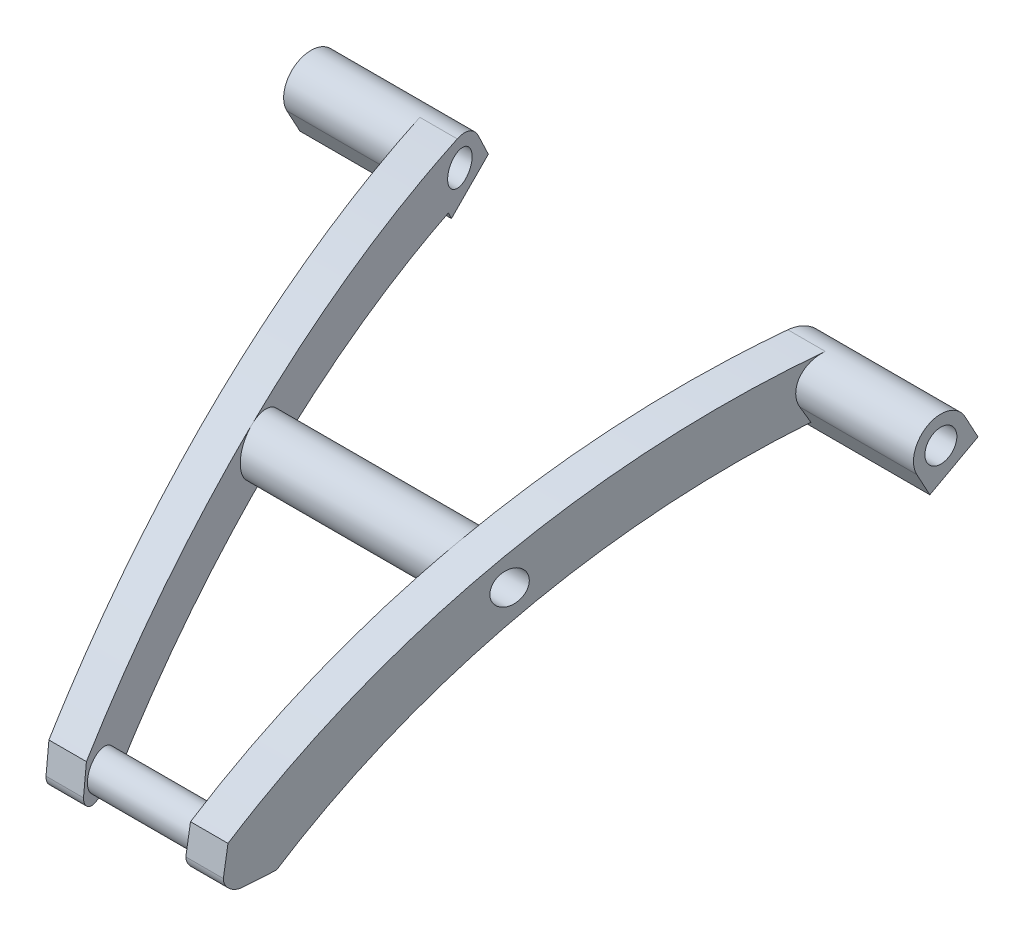
ISO-10303-21;
HEADER;
FILE_DESCRIPTION(('STEP AP214'),'2;1');
FILE_NAME('part.step','',(''),(''),'','','');
FILE_SCHEMA(('AUTOMOTIVE_DESIGN { 1 0 10303 214 1 1 1 1 }'));
ENDSEC;
DATA;
#1=APPLICATION_CONTEXT('core data for automotive mechanical design processes');
#2=APPLICATION_PROTOCOL_DEFINITION('international standard','automotive_design',2000,#1);
#3=PRODUCT_CONTEXT('',#1,'mechanical');
#4=PRODUCT('Part','Part','',(#3));
#5=PRODUCT_RELATED_PRODUCT_CATEGORY('part','',(#4));
#6=PRODUCT_DEFINITION_FORMATION('','',#4);
#7=PRODUCT_DEFINITION_CONTEXT('part definition',#1,'design');
#8=PRODUCT_DEFINITION('design','',#6,#7);
#9=PRODUCT_DEFINITION_SHAPE('','',#8);
#10=(LENGTH_UNIT() NAMED_UNIT(*) SI_UNIT(.MILLI.,.METRE.));
#11=(NAMED_UNIT(*) PLANE_ANGLE_UNIT() SI_UNIT($,.RADIAN.));
#12=(NAMED_UNIT(*) SI_UNIT($,.STERADIAN.) SOLID_ANGLE_UNIT());
#13=UNCERTAINTY_MEASURE_WITH_UNIT(LENGTH_MEASURE(1.E-05),#10,'distance_accuracy_value','');
#14=(GEOMETRIC_REPRESENTATION_CONTEXT(3) GLOBAL_UNCERTAINTY_ASSIGNED_CONTEXT((#13)) GLOBAL_UNIT_ASSIGNED_CONTEXT((#10,
#11,#12)) REPRESENTATION_CONTEXT('',''));
#15=CARTESIAN_POINT('',(0.,0.,0.));
#16=DIRECTION('',(0.,0.,1.));
#17=DIRECTION('',(1.,0.,0.));
#18=AXIS2_PLACEMENT_3D('',#15,#16,#17);
#19=CARTESIAN_POINT('',(25.,28.8834396302653,-28.4022512521021));
#20=DIRECTION('',(-1.,0.,0.));
#21=DIRECTION('',(0.,0.,1.));
#22=AXIS2_PLACEMENT_3D('',#19,#20,#21);
#23=CYLINDRICAL_SURFACE('',#22,3.);
#24=DIRECTION('',(-1.,0.,0.));
#25=VECTOR('',#24,1.);
#26=CARTESIAN_POINT('',(-9.57284418389617,27.4550759367041,-25.7641122946331));
#27=LINE('',#26,#25);
#28=CARTESIAN_POINT('',(-21.6814400977122,27.4550759367041,-25.7641122946331));
#29=VERTEX_POINT('',#28);
#30=CARTESIAN_POINT('',(-34.5,27.4550759367041,-25.7641122946331));
#31=VERTEX_POINT('',#30);
#32=EDGE_CURVE('E248',#29,#31,#27,.T.);
#33=ORIENTED_EDGE('',*,*,#32,.F.);
#34=CARTESIAN_POINT('',(-22.2984068436938,28.8834396302653,-28.4022512521021));
#35=DIRECTION('',(-0.97372665959155,0.,0.227719986827421));
#36=DIRECTION('',(-0.227719986827421,0.,-0.97372665959155));
#37=AXIS2_PLACEMENT_3D('',#34,#35,#36);
#38=ELLIPSE('',#37,3.0809467630869,3.00000000000001);
#39=CARTESIAN_POINT('',(-22.2114406576386,31.8603030408866,-28.0303853696876));
#40=VERTEX_POINT('',#39);
#41=EDGE_CURVE('E399',#40,#29,#38,.F.);
#42=ORIENTED_EDGE('',*,*,#41,.F.);
#43=DIRECTION('',(1.,0.,0.));
#44=VECTOR('',#43,1.);
#45=CARTESIAN_POINT('',(-35.,31.8603030408866,-28.0303853696876));
#46=LINE('',#45,#44);
#47=CARTESIAN_POINT('',(-18.1035116401894,31.8603030408866,-28.0303853696876));
#48=VERTEX_POINT('',#47);
#49=EDGE_CURVE('E411',#40,#48,#46,.T.);
#50=ORIENTED_EDGE('',*,*,#49,.T.);
#51=CARTESIAN_POINT('',(-18.1904778262447,28.8834396302653,-28.4022512521021));
#52=DIRECTION('',(0.97372665959155,0.,-0.227719986827422));
#53=DIRECTION('',(-0.227719986827422,0.,-0.97372665959155));
#54=AXIS2_PLACEMENT_3D('',#51,#52,#53);
#55=ELLIPSE('',#54,3.08094676308689,3.);
#56=CARTESIAN_POINT('',(-18.8074445722263,30.3118033238266,-31.0403902095713));
#57=VERTEX_POINT('',#56);
#58=EDGE_CURVE('E40',#57,#48,#55,.T.);
#59=ORIENTED_EDGE('',*,*,#58,.F.);
#60=DIRECTION('',(-1.,0.,0.));
#61=VECTOR('',#60,1.);
#62=CARTESIAN_POINT('',(-9.57284418389617,30.3118033238266,-31.0403902095712));
#63=LINE('',#62,#61);
#64=CARTESIAN_POINT('',(-34.5,30.3118033238266,-31.0403902095713));
#65=VERTEX_POINT('',#64);
#66=EDGE_CURVE('E223',#57,#65,#63,.T.);
#67=ORIENTED_EDGE('',*,*,#66,.T.);
#68=CARTESIAN_POINT('',(-34.5,28.8834396302653,-28.4022512521021));
#69=DIRECTION('',(1.,0.,0.));
#70=DIRECTION('',(0.,0.,-1.));
#71=AXIS2_PLACEMENT_3D('',#68,#69,#70);
#72=CIRCLE('',#71,3.00000000000001);
#73=EDGE_CURVE('E389',#65,#31,#72,.T.);
#74=ORIENTED_EDGE('',*,*,#73,.T.);
#75=EDGE_LOOP('',(#33,#42,#50,#59,#67,#74));
#76=FACE_BOUND('',#75,.T.);
#77=ADVANCED_FACE('F35',(#76),#23,.T.);
#78=CARTESIAN_POINT('',(34.5,26.2077751186646,-29.7590192578277));
#79=DIRECTION('',(0.,0.47612123118708,-0.879379652489696));
#80=VECTOR('',#79,1.);
#81=LINE('',#78,#80);
#82=CARTESIAN_POINT('',(34.5,26.2077751186662,-29.7590192578307));
#83=VERTEX_POINT('',#82);
#84=CARTESIAN_POINT('',(34.5,26.2847415479772,-29.9011736240457));
#85=VERTEX_POINT('',#84);
#86=EDGE_CURVE('E46',#83,#85,#81,.T.);
#87=ORIENTED_EDGE('',*,*,#86,.F.);
#88=DIRECTION('',(-1.,0.,0.));
#89=VECTOR('',#88,1.);
#90=CARTESIAN_POINT('',(25.,26.2077751186647,-29.7590192578279));
#91=LINE('',#90,#89);
#92=CARTESIAN_POINT('',(18.5077775420822,26.2077751186648,-29.7590192578282));
#93=VERTEX_POINT('',#92);
#94=EDGE_CURVE('E313',#83,#93,#91,.T.);
#95=ORIENTED_EDGE('',*,*,#94,.T.);
#96=CARTESIAN_POINT('',(18.5410223855738,26.2847415479754,-29.9011736240423));
#97=DIRECTION('',(-0.201439825914028,-0.466361170430847,0.861353153619406));
#98=VECTOR('',#97,1.);
#99=LINE('',#96,#98);
#100=CARTESIAN_POINT('',(18.5410223855738,26.2847415479754,-29.9011736240423));
#101=VERTEX_POINT('',#100);
#102=EDGE_CURVE('E11',#101,#93,#99,.T.);
#103=ORIENTED_EDGE('',*,*,#102,.F.);
#104=DIRECTION('',(-1.,0.,0.));
#105=VECTOR('',#104,1.);
#106=CARTESIAN_POINT('',(25.,26.2847415479755,-29.9011736240425));
#107=LINE('',#106,#105);
#108=EDGE_CURVE('E524',#101,#85,#107,.F.);
#109=ORIENTED_EDGE('',*,*,#108,.T.);
#110=EDGE_LOOP('',(#87,#95,#103,#109));
#111=FACE_BOUND('',#110,.T.);
#112=ADVANCED_FACE('F37',(#111),#23,.T.);
#113=CARTESIAN_POINT('',(34.5,28.8834396302653,-28.4022512521021));
#114=DIRECTION('',(1.,0.,0.));
#115=DIRECTION('',(0.,0.,-1.));
#116=AXIS2_PLACEMENT_3D('',#113,#114,#115);
#117=CIRCLE('',#116,3.00000000000001);
#118=CARTESIAN_POINT('',(34.5,30.3118033238266,-31.0403902095712));
#119=VERTEX_POINT('',#118);
#120=CARTESIAN_POINT('',(34.5,27.4550759367041,-25.7641122946331));
#121=VERTEX_POINT('',#120);
#122=EDGE_CURVE('E397',#119,#121,#117,.T.);
#123=ORIENTED_EDGE('',*,*,#122,.F.);
#124=DIRECTION('',(1.,0.,0.));
#125=VECTOR('',#124,1.);
#126=CARTESIAN_POINT('',(9.57284418389617,30.3118033238266,-31.0403902095712));
#127=LINE('',#126,#125);
#128=CARTESIAN_POINT('',(18.8074445722263,30.3118033238266,-31.0403902095713));
#129=VERTEX_POINT('',#128);
#130=EDGE_CURVE('E556',#129,#119,#127,.T.);
#131=ORIENTED_EDGE('',*,*,#130,.F.);
#132=CARTESIAN_POINT('',(18.1904778262447,28.8834396302653,-28.4022512521021));
#133=DIRECTION('',(-0.97372665959155,0.,-0.227719986827422));
#134=DIRECTION('',(-0.227719986827422,0.,0.97372665959155));
#135=AXIS2_PLACEMENT_3D('',#132,#133,#134);
#136=ELLIPSE('',#135,3.08094676308689,3.);
#137=CARTESIAN_POINT('',(18.1035116401894,31.8603030408866,-28.0303853696876));
#138=VERTEX_POINT('',#137);
#139=EDGE_CURVE('E382',#138,#129,#136,.T.);
#140=ORIENTED_EDGE('',*,*,#139,.F.);
#141=DIRECTION('',(-1.,0.,0.));
#142=VECTOR('',#141,1.);
#143=CARTESIAN_POINT('',(35.,31.8603030408866,-28.0303853696876));
#144=LINE('',#143,#142);
#145=CARTESIAN_POINT('',(22.2114406576386,31.8603030408866,-28.0303853696876));
#146=VERTEX_POINT('',#145);
#147=EDGE_CURVE('E431',#146,#138,#144,.T.);
#148=ORIENTED_EDGE('',*,*,#147,.F.);
#149=CARTESIAN_POINT('',(22.2984068436938,28.8834396302653,-28.4022512521021));
#150=DIRECTION('',(0.97372665959155,0.,0.227719986827421));
#151=DIRECTION('',(-0.227719986827421,0.,0.97372665959155));
#152=AXIS2_PLACEMENT_3D('',#149,#150,#151);
#153=ELLIPSE('',#152,3.0809467630869,3.00000000000001);
#154=CARTESIAN_POINT('',(21.6814400977122,27.4550759367041,-25.7641122946331));
#155=VERTEX_POINT('',#154);
#156=EDGE_CURVE('E402',#155,#146,#153,.F.);
#157=ORIENTED_EDGE('',*,*,#156,.F.);
#158=DIRECTION('',(1.,0.,0.));
#159=VECTOR('',#158,1.);
#160=CARTESIAN_POINT('',(9.57284418389617,27.4550759367041,-25.7641122946331));
#161=LINE('',#160,#159);
#162=EDGE_CURVE('E559',#155,#121,#161,.T.);
#163=ORIENTED_EDGE('',*,*,#162,.T.);
#164=EDGE_LOOP('',(#123,#131,#140,#148,#157,#163));
#165=FACE_BOUND('',#164,.T.);
#166=ADVANCED_FACE('F566',(#165),#23,.T.);
#167=CARTESIAN_POINT('',(14.3680518685044,35.,5.50780717952156));
#168=DIRECTION('',(0.97372665959155,0.,0.227719986827421));
#169=DIRECTION('',(0.227719986827421,0.,-0.97372665959155));
#170=AXIS2_PLACEMENT_3D('',#167,#168,#169);
#171=PLANE('',#170);
#172=DIRECTION('',(0.110663888595549,-0.873978405156209,-0.473196841791576));
#173=VECTOR('',#172,1.);
#174=CARTESIAN_POINT('',(19.2245687294309,46.8584472385399,-15.258573523916));
#175=LINE('',#174,#173);
#176=CARTESIAN_POINT('',(21.9126628369116,25.6289727389399,-26.7528166617771));
#177=VERTEX_POINT('',#176);
#178=EDGE_CURVE('E540',#155,#177,#175,.T.);
#179=ORIENTED_EDGE('',*,*,#178,.F.);
#180=ORIENTED_EDGE('',*,*,#156,.T.);
#181=CARTESIAN_POINT('',(24.8073708364518,-56.9987112077762,-39.1305371691182));
#182=DIRECTION('',(0.97372665959155,0.,0.227719986827422));
#183=DIRECTION('',(-0.227719986827422,0.,0.97372665959155));
#184=AXIS2_PLACEMENT_3D('',#181,#182,#183);
#185=ELLIPSE('',#184,91.9658897830885,89.5496386548514);
#186=CARTESIAN_POINT('',(9.80952217375532,5.50258466370808,25.));
#187=VERTEX_POINT('',#186);
#188=EDGE_CURVE('E436',#187,#146,#185,.F.);
#189=ORIENTED_EDGE('',*,*,#188,.F.);
#190=DIRECTION('',(-0.0303279647842555,-0.991091738362253,0.129681844149954));
#191=VECTOR('',#190,1.);
#192=CARTESIAN_POINT('',(9.76413627586377,4.01941265534983,25.1940693013477));
#193=LINE('',#192,#191);
#194=CARTESIAN_POINT('',(9.71235824698797,2.32735131814709,25.4154712423889));
#195=VERTEX_POINT('',#194);
#196=EDGE_CURVE('E349',#187,#195,#193,.T.);
#197=ORIENTED_EDGE('',*,*,#196,.T.);
#198=CARTESIAN_POINT('',(10.0654934689954,2.32735131814709,23.9054712423889));
#199=DIRECTION('',(0.97372665959155,0.,0.227719986827421));
#200=DIRECTION('',(-0.227719986827421,0.,0.97372665959155));
#201=AXIS2_PLACEMENT_3D('',#198,#199,#200);
#202=ELLIPSE('',#201,1.55074320408707,1.51);
#203=CARTESIAN_POINT('',(10.0654934689954,0.817351318147083,23.9054712423889));
#204=VERTEX_POINT('',#203);
#205=EDGE_CURVE('E368',#204,#195,#202,.F.);
#206=ORIENTED_EDGE('',*,*,#205,.F.);
#207=DIRECTION('',(-0.225158086653155,-0.149578990823146,0.962772019493202));
#208=VECTOR('',#207,1.);
#209=CARTESIAN_POINT('',(22.8944521012841,9.33999740229893,-30.9509302930799));
#210=LINE('',#209,#208);
#211=CARTESIAN_POINT('',(10.8144072110072,1.31487625012658,20.7031292499852));
#212=VERTEX_POINT('',#211);
#213=EDGE_CURVE('E358',#212,#204,#210,.T.);
#214=ORIENTED_EDGE('',*,*,#213,.F.);
#215=CARTESIAN_POINT('',(24.8073708364518,-56.9987112077762,-39.1305371691182));
#216=DIRECTION('',(0.97372665959155,0.,0.227719986827422));
#217=DIRECTION('',(-0.227719986827422,0.,0.97372665959155));
#218=AXIS2_PLACEMENT_3D('',#215,#216,#217);
#219=ELLIPSE('',#218,85.8039962569147,83.5496386548514);
#220=EDGE_CURVE('E434',#177,#212,#219,.T.);
#221=ORIENTED_EDGE('',*,*,#220,.F.);
#222=EDGE_LOOP('',(#179,#180,#189,#197,#206,#214,#221));
#223=FACE_BOUND('',#222,.T.);
#224=CARTESIAN_POINT('',(15.6561318096398,20.2,0.));
#225=DIRECTION('',(0.97372665959155,0.,0.227719986827421));
#226=DIRECTION('',(-0.227719986827421,0.,0.97372665959155));
#227=AXIS2_PLACEMENT_3D('',#224,#225,#226);
#228=ELLIPSE('',#227,1.79721894513402,1.75);
#229=CARTESIAN_POINT('',(15.2468691351279,20.2,1.75));
#230=VERTEX_POINT('',#229);
#231=EDGE_CURVE('E424',#230,#230,#228,.F.);
#232=ORIENTED_EDGE('',*,*,#231,.T.);
#233=EDGE_LOOP('',(#232));
#234=FACE_BOUND('',#233,.T.);
#235=ADVANCED_FACE('F509',(#223,#234),#171,.T.);
#236=CARTESIAN_POINT('',(18.8920709825508,-4.,-31.4022512521022));
#237=DIRECTION('',(-0.97372665959155,0.,-0.227719986827422));
#238=DIRECTION('',(-0.227719986827422,0.,0.97372665959155));
#239=AXIS2_PLACEMENT_3D('',#236,#237,#238);
#240=PLANE('',#239);
#241=CARTESIAN_POINT('',(6.20403567493547,3.40873045691285,22.8515646249687));
#242=DIRECTION('',(-0.97372665959155,0.,-0.227719986827422));
#243=DIRECTION('',(-0.227719986827422,0.,0.97372665959155));
#244=AXIS2_PLACEMENT_3D('',#241,#242,#243);
#245=ELLIPSE('',#244,2.0539645087246,2.);
#246=CARTESIAN_POINT('',(5.73630690406471,3.40873045691285,24.8515646249687));
#247=VERTEX_POINT('',#246);
#248=EDGE_CURVE('E346',#247,#247,#245,.T.);
#249=ORIENTED_EDGE('',*,*,#248,.F.);
#250=EDGE_LOOP('',(#249));
#251=FACE_BOUND('',#250,.T.);
#252=DIRECTION('',(-0.0303279647842556,-0.991091738362253,0.129681844149954));
#253=VECTOR('',#252,1.);
#254=CARTESIAN_POINT('',(5.64992810809587,3.8142154372355,25.220918837702));
#255=LINE('',#254,#253);
#256=CARTESIAN_POINT('',(5.70159315630614,5.50258466370808,25.));
#257=VERTEX_POINT('',#256);
#258=CARTESIAN_POINT('',(5.60442922935688,2.32735131814709,25.4154712423889));
#259=VERTEX_POINT('',#258);
#260=EDGE_CURVE('E359',#257,#259,#255,.T.);
#261=ORIENTED_EDGE('',*,*,#260,.F.);
#262=CARTESIAN_POINT('',(20.6994418190027,-56.9987112077762,-39.1305371691182));
#263=DIRECTION('',(-0.97372665959155,0.,-0.227719986827422));
#264=DIRECTION('',(-0.227719986827422,0.,0.97372665959155));
#265=AXIS2_PLACEMENT_3D('',#262,#263,#264);
#266=ELLIPSE('',#265,91.9658897830885,89.5496386548514);
#267=CARTESIAN_POINT('',(11.2310008083681,22.8758763782585,1.35635010534817));
#268=VERTEX_POINT('',#267);
#269=EDGE_CURVE('E442',#268,#257,#266,.F.);
#270=ORIENTED_EDGE('',*,*,#269,.F.);
#271=CARTESIAN_POINT('',(11.5482027921906,20.2,0.));
#272=DIRECTION('',(-0.97372665959155,0.,-0.227719986827422));
#273=DIRECTION('',(-0.227719986827422,0.,0.97372665959155));
#274=AXIS2_PLACEMENT_3D('',#271,#272,#273);
#275=ELLIPSE('',#274,3.08094676308689,3.);
#276=CARTESIAN_POINT('',(11.8654047760131,17.5241236217415,-1.35635010534817));
#277=VERTEX_POINT('',#276);
#278=EDGE_CURVE('E427',#268,#277,#275,.F.);
#279=ORIENTED_EDGE('',*,*,#278,.T.);
#280=CARTESIAN_POINT('',(20.6994418190027,-56.9987112077762,-39.1305371691182));
#281=DIRECTION('',(-0.97372665959155,0.,-0.227719986827422));
#282=DIRECTION('',(-0.227719986827422,0.,0.97372665959155));
#283=AXIS2_PLACEMENT_3D('',#280,#281,#282);
#284=ELLIPSE('',#283,85.8039962569147,83.5496386548514);
#285=CARTESIAN_POINT('',(6.70647819356479,1.31487625011762,20.7031292499374));
#286=VERTEX_POINT('',#285);
#287=EDGE_CURVE('E440',#286,#277,#284,.T.);
#288=ORIENTED_EDGE('',*,*,#287,.F.);
#289=DIRECTION('',(-0.225158086653156,-0.149578990823146,0.962772019493202));
#290=VECTOR('',#289,1.);
#291=CARTESIAN_POINT('',(18.4404327701069,9.11007965592523,-29.4710541970093));
#292=LINE('',#291,#290);
#293=CARTESIAN_POINT('',(5.9575644513643,0.817351318147084,23.9054712423889));
#294=VERTEX_POINT('',#293);
#295=EDGE_CURVE('E350',#286,#294,#292,.T.);
#296=ORIENTED_EDGE('',*,*,#295,.T.);
#297=CARTESIAN_POINT('',(5.9575644513643,0.817351318147084,23.9054712423889));
#298=CARTESIAN_POINT('',(5.75070262766399,0.817351318147086,24.7900087632056));
#299=CARTESIAN_POINT('',(5.60442922935688,1.44281379733046,25.4154712423889));
#300=CARTESIAN_POINT('',(5.60442922935688,2.32735131814709,25.4154712423889));
#301=(BOUNDED_CURVE() B_SPLINE_CURVE(3,(#297,#298,#299,#300),.UNSPECIFIED.,.F.,
.F.) B_SPLINE_CURVE_WITH_KNOTS((4,4),(0.,1.),
.UNSPECIFIED.) CURVE() GEOMETRIC_REPRESENTATION_ITEM() RATIONAL_B_SPLINE_CURVE((1.,
0.804737854124365,0.804737854124365,1.)) REPRESENTATION_ITEM(''));
#302=EDGE_CURVE('E353',#294,#259,#301,.T.);
#303=ORIENTED_EDGE('',*,*,#302,.T.);
#304=EDGE_LOOP('',(#261,#270,#279,#288,#296,#303));
#305=FACE_BOUND('',#304,.T.);
#306=ADVANCED_FACE('F504',(#251,#305),#240,.T.);
#307=CARTESIAN_POINT('',(35.,-56.9987112077762,-39.1305371691182));
#308=DIRECTION('',(-1.,0.,0.));
#309=DIRECTION('',(0.,0.,1.));
#310=AXIS2_PLACEMENT_3D('',#307,#308,#309);
#311=CYLINDRICAL_SURFACE('',#310,89.5496386548514);
#312=DIRECTION('',(-1.,0.,0.));
#313=VECTOR('',#312,1.);
#314=CARTESIAN_POINT('',(35.,5.50258466370808,25.));
#315=LINE('',#314,#313);
#316=EDGE_CURVE('E378',#257,#187,#315,.F.);
#317=ORIENTED_EDGE('',*,*,#316,.T.);
#318=ORIENTED_EDGE('',*,*,#188,.T.);
#319=ORIENTED_EDGE('',*,*,#147,.T.);
#320=EDGE_CURVE('E443',#138,#268,#266,.F.);
#321=ORIENTED_EDGE('',*,*,#320,.T.);
#322=ORIENTED_EDGE('',*,*,#269,.T.);
#323=EDGE_LOOP('',(#317,#318,#319,#321,#322));
#324=FACE_BOUND('',#323,.T.);
#325=ADVANCED_FACE('F501',(#324),#311,.T.);
#326=CARTESIAN_POINT('',(-18.5077775420822,26.2077751186648,-29.7590192578282));
#327=VERTEX_POINT('',#326);
#328=CARTESIAN_POINT('',(-18.5410223855738,26.2847415479754,-29.9011736240423));
#329=VERTEX_POINT('',#328);
#330=EDGE_CURVE('E231',#327,#329,#55,.T.);
#331=ORIENTED_EDGE('',*,*,#330,.F.);
#332=DIRECTION('',(1.,0.,0.));
#333=VECTOR('',#332,1.);
#334=CARTESIAN_POINT('',(-25.,26.2077751186647,-29.7590192578279));
#335=LINE('',#334,#333);
#336=CARTESIAN_POINT('',(-34.5,26.2077751186662,-29.7590192578307));
#337=VERTEX_POINT('',#336);
#338=EDGE_CURVE('E266',#337,#327,#335,.T.);
#339=ORIENTED_EDGE('',*,*,#338,.F.);
#340=CARTESIAN_POINT('',(-34.5,26.2847415479772,-29.9011736240457));
#341=VERTEX_POINT('',#340);
#342=EDGE_CURVE('E281',#337,#341,#72,.T.);
#343=ORIENTED_EDGE('',*,*,#342,.T.);
#344=DIRECTION('',(1.,0.,0.));
#345=VECTOR('',#344,1.);
#346=CARTESIAN_POINT('',(-25.,26.2847415479755,-29.9011736240425));
#347=LINE('',#346,#345);
#348=EDGE_CURVE('E259',#329,#341,#347,.F.);
#349=ORIENTED_EDGE('',*,*,#348,.F.);
#350=EDGE_LOOP('',(#331,#339,#343,#349));
#351=FACE_BOUND('',#350,.T.);
#352=ADVANCED_FACE('F287',(#351),#23,.T.);
#353=CARTESIAN_POINT('',(25.,28.8834396302653,-28.4022512521021));
#354=DIRECTION('',(-1.,0.,0.));
#355=DIRECTION('',(0.,0.,1.));
#356=AXIS2_PLACEMENT_3D('',#353,#354,#355);
#357=CYLINDRICAL_SURFACE('',#356,1.75);
#358=CARTESIAN_POINT('',(18.1904778262447,28.8834396302653,-28.4022512521021));
#359=DIRECTION('',(-0.97372665959155,0.,-0.227719986827422));
#360=DIRECTION('',(-0.227719986827422,0.,0.97372665959155));
#361=AXIS2_PLACEMENT_3D('',#358,#359,#360);
#362=ELLIPSE('',#361,1.79721894513402,1.75);
#363=CARTESIAN_POINT('',(17.7812151517328,28.8834396302653,-26.6522512521021));
#364=VERTEX_POINT('',#363);
#365=EDGE_CURVE('E386',#364,#364,#362,.T.);
#366=ORIENTED_EDGE('',*,*,#365,.T.);
#367=EDGE_LOOP('',(#366));
#368=FACE_BOUND('',#367,.T.);
#369=CARTESIAN_POINT('',(34.5,28.8834396302653,-28.4022512521021));
#370=DIRECTION('',(1.,0.,0.));
#371=DIRECTION('',(0.,0.,-1.));
#372=AXIS2_PLACEMENT_3D('',#369,#370,#371);
#373=CIRCLE('',#372,1.75);
#374=CARTESIAN_POINT('',(34.5,28.8834396302653,-30.1522512521022));
#375=VERTEX_POINT('',#374);
#376=EDGE_CURVE('E390',#375,#375,#373,.T.);
#377=ORIENTED_EDGE('',*,*,#376,.T.);
#378=EDGE_LOOP('',(#377));
#379=FACE_BOUND('',#378,.T.);
#380=ADVANCED_FACE('F576',(#368,#379),#357,.F.);
#381=CARTESIAN_POINT('',(-34.5,28.8834396302653,-28.4022512521021));
#382=DIRECTION('',(1.,0.,0.));
#383=DIRECTION('',(0.,0.,-1.));
#384=AXIS2_PLACEMENT_3D('',#381,#382,#383);
#385=CIRCLE('',#384,1.75);
#386=CARTESIAN_POINT('',(-34.5,28.8834396302653,-30.1522512521022));
#387=VERTEX_POINT('',#386);
#388=EDGE_CURVE('E570',#387,#387,#385,.T.);
#389=ORIENTED_EDGE('',*,*,#388,.F.);
#390=EDGE_LOOP('',(#389));
#391=FACE_BOUND('',#390,.T.);
#392=CARTESIAN_POINT('',(-18.1904778262447,28.8834396302653,-28.4022512521021));
#393=DIRECTION('',(0.97372665959155,0.,-0.227719986827422));
#394=DIRECTION('',(-0.227719986827422,0.,-0.97372665959155));
#395=AXIS2_PLACEMENT_3D('',#392,#393,#394);
#396=ELLIPSE('',#395,1.79721894513402,1.75);
#397=CARTESIAN_POINT('',(-18.5997405007566,28.8834396302653,-30.1522512521022));
#398=VERTEX_POINT('',#397);
#399=EDGE_CURVE('E379',#398,#398,#396,.T.);
#400=ORIENTED_EDGE('',*,*,#399,.T.);
#401=EDGE_LOOP('',(#400));
#402=FACE_BOUND('',#401,.T.);
#403=ADVANCED_FACE('F488',(#391,#402),#357,.F.);
#404=CARTESIAN_POINT('',(-14.3680518685044,35.,5.50780717952156));
#405=DIRECTION('',(-0.97372665959155,0.,0.227719986827421));
#406=DIRECTION('',(-0.227719986827421,0.,-0.97372665959155));
#407=AXIS2_PLACEMENT_3D('',#404,#405,#406);
#408=PLANE('',#407);
#409=DIRECTION('',(-0.110663888595549,-0.873978405156209,-0.473196841791576));
#410=VECTOR('',#409,1.);
#411=CARTESIAN_POINT('',(-19.2245687294309,46.8584472385399,-15.258573523916));
#412=LINE('',#411,#410);
#413=CARTESIAN_POINT('',(-21.9126628369116,25.6289727389399,-26.7528166617771));
#414=VERTEX_POINT('',#413);
#415=EDGE_CURVE('E256',#29,#414,#412,.T.);
#416=ORIENTED_EDGE('',*,*,#415,.T.);
#417=CARTESIAN_POINT('',(-24.8073708364518,-56.9987112077762,-39.1305371691182));
#418=DIRECTION('',(0.97372665959155,0.,-0.227719986827422));
#419=DIRECTION('',(0.227719986827422,0.,0.97372665959155));
#420=AXIS2_PLACEMENT_3D('',#417,#418,#419);
#421=ELLIPSE('',#420,85.8039962569147,83.5496386548514);
#422=CARTESIAN_POINT('',(-10.814407211014,1.31487625011762,20.7031292499374));
#423=VERTEX_POINT('',#422);
#424=EDGE_CURVE('E414',#414,#423,#421,.T.);
#425=ORIENTED_EDGE('',*,*,#424,.T.);
#426=DIRECTION('',(0.225158086653155,-0.149578990823146,0.962772019493202));
#427=VECTOR('',#426,1.);
#428=CARTESIAN_POINT('',(-22.8944521012841,9.33999740229893,-30.9509302930799));
#429=LINE('',#428,#427);
#430=CARTESIAN_POINT('',(-10.0654934689954,0.817351318147083,23.9054712423889));
#431=VERTEX_POINT('',#430);
#432=EDGE_CURVE('E322',#423,#431,#429,.T.);
#433=ORIENTED_EDGE('',*,*,#432,.T.);
#434=CARTESIAN_POINT('',(-10.0654934689954,2.32735131814709,23.9054712423889));
#435=DIRECTION('',(0.97372665959155,0.,-0.227719986827421));
#436=DIRECTION('',(0.227719986827421,0.,0.97372665959155));
#437=AXIS2_PLACEMENT_3D('',#434,#435,#436);
#438=ELLIPSE('',#437,1.55074320408707,1.51);
#439=CARTESIAN_POINT('',(-9.71235824698797,2.32735131814709,25.4154712423889));
#440=VERTEX_POINT('',#439);
#441=EDGE_CURVE('E333',#431,#440,#438,.F.);
#442=ORIENTED_EDGE('',*,*,#441,.T.);
#443=DIRECTION('',(0.0303279647842555,-0.991091738362253,0.129681844149954));
#444=VECTOR('',#443,1.);
#445=CARTESIAN_POINT('',(-9.76413627586377,4.01941265534983,25.1940693013477));
#446=LINE('',#445,#444);
#447=CARTESIAN_POINT('',(-9.80952217375532,5.50258466370808,25.));
#448=VERTEX_POINT('',#447);
#449=EDGE_CURVE('E312',#448,#440,#446,.T.);
#450=ORIENTED_EDGE('',*,*,#449,.F.);
#451=CARTESIAN_POINT('',(-24.8073708364518,-56.9987112077762,-39.1305371691182));
#452=DIRECTION('',(0.97372665959155,0.,-0.227719986827422));
#453=DIRECTION('',(0.227719986827422,0.,0.97372665959155));
#454=AXIS2_PLACEMENT_3D('',#451,#452,#453);
#455=ELLIPSE('',#454,91.9658897830885,89.5496386548514);
#456=EDGE_CURVE('E416',#448,#40,#455,.F.);
#457=ORIENTED_EDGE('',*,*,#456,.T.);
#458=ORIENTED_EDGE('',*,*,#41,.T.);
#459=EDGE_LOOP('',(#416,#425,#433,#442,#450,#457,#458));
#460=FACE_BOUND('',#459,.T.);
#461=CARTESIAN_POINT('',(-15.6561318096398,20.2,0.));
#462=DIRECTION('',(0.97372665959155,0.,-0.227719986827421));
#463=DIRECTION('',(0.227719986827421,0.,0.97372665959155));
#464=AXIS2_PLACEMENT_3D('',#461,#462,#463);
#465=ELLIPSE('',#464,1.79721894513402,1.75);
#466=CARTESIAN_POINT('',(-15.2468691351279,20.2,1.75));
#467=VERTEX_POINT('',#466);
#468=EDGE_CURVE('E404',#467,#467,#465,.F.);
#469=ORIENTED_EDGE('',*,*,#468,.F.);
#470=EDGE_LOOP('',(#469));
#471=FACE_BOUND('',#470,.T.);
#472=ADVANCED_FACE('F484',(#460,#471),#408,.T.);
#473=ORIENTED_EDGE('',*,*,#102,.T.);
#474=DIRECTION('',(0.201439825914029,0.466361170430833,-0.861353153619414));
#475=VECTOR('',#474,1.);
#476=CARTESIAN_POINT('',(10.519647970562,7.71414586921741,4.39808233183414));
#477=LINE('',#476,#475);
#478=CARTESIAN_POINT('',(17.9074332178463,24.8178946397589,-27.1919574834661));
#479=VERTEX_POINT('',#478);
#480=EDGE_CURVE('E305',#479,#93,#477,.T.);
#481=ORIENTED_EDGE('',*,*,#480,.F.);
#482=DIRECTION('',(0.110663888595549,-0.873978405156209,-0.473196841791576));
#483=VECTOR('',#482,1.);
#484=CARTESIAN_POINT('',(18.7817684100109,17.9127507258965,-30.9305993914112));
#485=LINE('',#484,#483);
#486=CARTESIAN_POINT('',(17.8047338194625,25.6289727389399,-26.7528166617771));
#487=VERTEX_POINT('',#486);
#488=EDGE_CURVE('E301',#487,#479,#485,.T.);
#489=ORIENTED_EDGE('',*,*,#488,.F.);
#490=EDGE_CURVE('E439',#277,#487,#284,.T.);
#491=ORIENTED_EDGE('',*,*,#490,.F.);
#492=EDGE_CURVE('E430',#277,#268,#275,.F.);
#493=ORIENTED_EDGE('',*,*,#492,.T.);
#494=ORIENTED_EDGE('',*,*,#320,.F.);
#495=ORIENTED_EDGE('',*,*,#139,.T.);
#496=DIRECTION('',(-0.11066388859555,0.873978405156206,0.47319684179158));
#497=VECTOR('',#496,1.);
#498=CARTESIAN_POINT('',(20.0005905401055,20.8888215060021,-36.1422613887077));
#499=LINE('',#498,#497);
#500=CARTESIAN_POINT('',(19.1413667098096,27.6746220268814,-32.4682353984043));
#501=VERTEX_POINT('',#500);
#502=EDGE_CURVE('E533',#501,#129,#499,.T.);
#503=ORIENTED_EDGE('',*,*,#502,.F.);
#504=EDGE_CURVE('E307',#101,#501,#477,.T.);
#505=ORIENTED_EDGE('',*,*,#504,.F.);
#506=EDGE_LOOP('',(#473,#481,#489,#491,#493,#494,#495,#503,#505));
#507=FACE_BOUND('',#506,.T.);
#508=ORIENTED_EDGE('',*,*,#365,.F.);
#509=EDGE_LOOP('',(#508));
#510=FACE_BOUND('',#509,.T.);
#511=ADVANCED_FACE('F487',(#507,#510),#240,.T.);
#512=CARTESIAN_POINT('',(35.,-56.9987112077762,-39.1305371691182));
#513=DIRECTION('',(-1.,0.,0.));
#514=DIRECTION('',(0.,0.,1.));
#515=AXIS2_PLACEMENT_3D('',#512,#513,#514);
#516=CYLINDRICAL_SURFACE('',#515,83.5496386548514);
#517=ORIENTED_EDGE('',*,*,#490,.T.);
#518=DIRECTION('',(-1.,0.,0.));
#519=VECTOR('',#518,1.);
#520=CARTESIAN_POINT('',(35.,25.6289727389399,-26.7528166617771));
#521=LINE('',#520,#519);
#522=EDGE_CURVE('E543',#487,#177,#521,.F.);
#523=ORIENTED_EDGE('',*,*,#522,.T.);
#524=ORIENTED_EDGE('',*,*,#220,.T.);
#525=DIRECTION('',(1.,0.,0.));
#526=VECTOR('',#525,1.);
#527=CARTESIAN_POINT('',(-34.5,1.31487625011762,20.7031292499374));
#528=LINE('',#527,#526);
#529=EDGE_CURVE('E365',#286,#212,#528,.T.);
#530=ORIENTED_EDGE('',*,*,#529,.F.);
#531=ORIENTED_EDGE('',*,*,#287,.T.);
#532=EDGE_LOOP('',(#517,#523,#524,#530,#531));
#533=FACE_BOUND('',#532,.T.);
#534=ADVANCED_FACE('F496',(#533),#516,.F.);
#535=CARTESIAN_POINT('',(25.,20.2,0.));
#536=DIRECTION('',(-1.,0.,0.));
#537=DIRECTION('',(0.,0.,1.));
#538=AXIS2_PLACEMENT_3D('',#535,#536,#537);
#539=CYLINDRICAL_SURFACE('',#538,3.);
#540=ORIENTED_EDGE('',*,*,#492,.F.);
#541=ORIENTED_EDGE('',*,*,#278,.F.);
#542=EDGE_LOOP('',(#540,#541));
#543=FACE_BOUND('',#542,.T.);
#544=CARTESIAN_POINT('',(-11.5482027921906,20.2,0.));
#545=DIRECTION('',(-0.97372665959155,0.,0.227719986827422));
#546=DIRECTION('',(0.227719986827422,0.,0.97372665959155));
#547=AXIS2_PLACEMENT_3D('',#544,#545,#546);
#548=ELLIPSE('',#547,3.08094676308689,3.);
#549=CARTESIAN_POINT('',(-11.8654047760131,17.5241236217415,-1.35635010534817));
#550=VERTEX_POINT('',#549);
#551=CARTESIAN_POINT('',(-11.2310008083681,22.8758763782585,1.35635010534817));
#552=VERTEX_POINT('',#551);
#553=EDGE_CURVE('E410',#550,#552,#548,.F.);
#554=ORIENTED_EDGE('',*,*,#553,.T.);
#555=EDGE_CURVE('E407',#552,#550,#548,.F.);
#556=ORIENTED_EDGE('',*,*,#555,.T.);
#557=EDGE_LOOP('',(#554,#556));
#558=FACE_BOUND('',#557,.T.);
#559=ADVANCED_FACE('F492',(#543,#558),#539,.T.);
#560=CARTESIAN_POINT('',(25.,20.2,0.));
#561=DIRECTION('',(-1.,0.,0.));
#562=DIRECTION('',(0.,0.,1.));
#563=AXIS2_PLACEMENT_3D('',#560,#561,#562);
#564=CYLINDRICAL_SURFACE('',#563,1.75);
#565=ORIENTED_EDGE('',*,*,#231,.F.);
#566=EDGE_LOOP('',(#565));
#567=FACE_BOUND('',#566,.T.);
#568=ORIENTED_EDGE('',*,*,#468,.T.);
#569=EDGE_LOOP('',(#568));
#570=FACE_BOUND('',#569,.T.);
#571=ADVANCED_FACE('F482',(#567,#570),#564,.F.);
#572=CARTESIAN_POINT('',(-18.8920709825508,-4.,-31.4022512521022));
#573=DIRECTION('',(0.97372665959155,0.,-0.227719986827422));
#574=DIRECTION('',(0.227719986827422,0.,0.97372665959155));
#575=AXIS2_PLACEMENT_3D('',#572,#573,#574);
#576=PLANE('',#575);
#577=CARTESIAN_POINT('',(-20.6994418190027,-56.9987112077762,-39.1305371691182));
#578=DIRECTION('',(-0.97372665959155,0.,0.227719986827422));
#579=DIRECTION('',(0.227719986827422,0.,0.97372665959155));
#580=AXIS2_PLACEMENT_3D('',#577,#578,#579);
#581=ELLIPSE('',#580,91.9658897830885,89.5496386548514);
#582=CARTESIAN_POINT('',(-5.70159315630614,5.5025846637081,25.));
#583=VERTEX_POINT('',#582);
#584=EDGE_CURVE('E421',#552,#583,#581,.F.);
#585=ORIENTED_EDGE('',*,*,#584,.T.);
#586=DIRECTION('',(0.0303279647842556,-0.991091738362253,0.129681844149954));
#587=VECTOR('',#586,1.);
#588=CARTESIAN_POINT('',(-5.64992810809587,3.8142154372355,25.220918837702));
#589=LINE('',#588,#587);
#590=CARTESIAN_POINT('',(-5.60442922935688,2.32735131814709,25.4154712423889));
#591=VERTEX_POINT('',#590);
#592=EDGE_CURVE('E323',#583,#591,#589,.T.);
#593=ORIENTED_EDGE('',*,*,#592,.T.);
#594=CARTESIAN_POINT('',(-5.9575644513643,0.817351318147084,23.9054712423889));
#595=CARTESIAN_POINT('',(-5.75070262766399,0.817351318147086,24.7900087632056));
#596=CARTESIAN_POINT('',(-5.60442922935688,1.44281379733046,25.4154712423889));
#597=CARTESIAN_POINT('',(-5.60442922935688,2.32735131814709,25.4154712423889));
#598=(BOUNDED_CURVE() B_SPLINE_CURVE(3,(#594,#595,#596,#597),.UNSPECIFIED.,.F.,
.F.) B_SPLINE_CURVE_WITH_KNOTS((4,4),(0.,1.),
.UNSPECIFIED.) CURVE() GEOMETRIC_REPRESENTATION_ITEM() RATIONAL_B_SPLINE_CURVE((1.,
0.804737854124365,0.804737854124365,1.)) REPRESENTATION_ITEM(''));
#599=CARTESIAN_POINT('',(-5.9575644513643,0.817351318147084,23.9054712423889));
#600=VERTEX_POINT('',#599);
#601=EDGE_CURVE('E317',#600,#591,#598,.T.);
#602=ORIENTED_EDGE('',*,*,#601,.F.);
#603=DIRECTION('',(0.225158086653156,-0.149578990823146,0.962772019493202));
#604=VECTOR('',#603,1.);
#605=CARTESIAN_POINT('',(-18.4404327701069,9.11007965592523,-29.4710541970093));
#606=LINE('',#605,#604);
#607=CARTESIAN_POINT('',(-6.70647819356479,1.31487625011762,20.7031292499374));
#608=VERTEX_POINT('',#607);
#609=EDGE_CURVE('E314',#608,#600,#606,.T.);
#610=ORIENTED_EDGE('',*,*,#609,.F.);
#611=CARTESIAN_POINT('',(-20.6994418190027,-56.9987112077762,-39.1305371691182));
#612=DIRECTION('',(-0.97372665959155,0.,0.227719986827422));
#613=DIRECTION('',(0.227719986827422,0.,0.97372665959155));
#614=AXIS2_PLACEMENT_3D('',#611,#612,#613);
#615=ELLIPSE('',#614,85.8039962569147,83.5496386548514);
#616=EDGE_CURVE('E419',#608,#550,#615,.T.);
#617=ORIENTED_EDGE('',*,*,#616,.T.);
#618=ORIENTED_EDGE('',*,*,#555,.F.);
#619=EDGE_LOOP('',(#585,#593,#602,#610,#617,#618));
#620=FACE_BOUND('',#619,.T.);
#621=CARTESIAN_POINT('',(-6.20403567493547,3.40873045691285,22.8515646249687));
#622=DIRECTION('',(-0.97372665959155,0.,0.227719986827422));
#623=DIRECTION('',(0.227719986827422,0.,0.97372665959155));
#624=AXIS2_PLACEMENT_3D('',#621,#622,#623);
#625=ELLIPSE('',#624,2.0539645087246,2.);
#626=CARTESIAN_POINT('',(-5.73630690406471,3.40873045691285,24.8515646249687));
#627=VERTEX_POINT('',#626);
#628=EDGE_CURVE('E309',#627,#627,#625,.T.);
#629=ORIENTED_EDGE('',*,*,#628,.T.);
#630=EDGE_LOOP('',(#629));
#631=FACE_BOUND('',#630,.T.);
#632=ADVANCED_FACE('F478',(#620,#631),#576,.T.);
#633=CARTESIAN_POINT('',(-35.,-56.9987112077762,-39.1305371691182));
#634=DIRECTION('',(1.,0.,0.));
#635=DIRECTION('',(0.,0.,1.));
#636=AXIS2_PLACEMENT_3D('',#633,#634,#635);
#637=CYLINDRICAL_SURFACE('',#636,89.5496386548514);
#638=ORIENTED_EDGE('',*,*,#456,.F.);
#639=DIRECTION('',(1.,0.,0.));
#640=VECTOR('',#639,1.);
#641=CARTESIAN_POINT('',(-35.,5.50258466370808,25.));
#642=LINE('',#641,#640);
#643=EDGE_CURVE('E343',#583,#448,#642,.F.);
#644=ORIENTED_EDGE('',*,*,#643,.F.);
#645=ORIENTED_EDGE('',*,*,#584,.F.);
#646=EDGE_CURVE('E422',#48,#552,#581,.F.);
#647=ORIENTED_EDGE('',*,*,#646,.F.);
#648=ORIENTED_EDGE('',*,*,#49,.F.);
#649=EDGE_LOOP('',(#638,#644,#645,#647,#648));
#650=FACE_BOUND('',#649,.T.);
#651=ADVANCED_FACE('F475',(#650),#637,.T.);
#652=DIRECTION('',(-0.201439825914029,0.466361170430833,-0.861353153619414));
#653=VECTOR('',#652,1.);
#654=CARTESIAN_POINT('',(-10.519647970562,7.71414586921741,4.39808233183414));
#655=LINE('',#654,#653);
#656=CARTESIAN_POINT('',(-17.9074332178463,24.8178946397589,-27.1919574834661));
#657=VERTEX_POINT('',#656);
#658=EDGE_CURVE('E220',#657,#327,#655,.T.);
#659=ORIENTED_EDGE('',*,*,#658,.T.);
#660=ORIENTED_EDGE('',*,*,#330,.T.);
#661=CARTESIAN_POINT('',(-19.1413667098096,27.6746220268814,-32.4682353984043));
#662=VERTEX_POINT('',#661);
#663=EDGE_CURVE('E216',#329,#662,#655,.T.);
#664=ORIENTED_EDGE('',*,*,#663,.T.);
#665=DIRECTION('',(0.11066388859555,0.873978405156206,0.47319684179158));
#666=VECTOR('',#665,1.);
#667=CARTESIAN_POINT('',(-20.0005905401055,20.8888215060021,-36.1422613887077));
#668=LINE('',#667,#666);
#669=EDGE_CURVE('E219',#662,#57,#668,.T.);
#670=ORIENTED_EDGE('',*,*,#669,.T.);
#671=ORIENTED_EDGE('',*,*,#58,.T.);
#672=ORIENTED_EDGE('',*,*,#646,.T.);
#673=ORIENTED_EDGE('',*,*,#553,.F.);
#674=CARTESIAN_POINT('',(-17.8047338194625,25.6289727389399,-26.7528166617771));
#675=VERTEX_POINT('',#674);
#676=EDGE_CURVE('E418',#550,#675,#615,.T.);
#677=ORIENTED_EDGE('',*,*,#676,.T.);
#678=DIRECTION('',(-0.110663888595549,-0.873978405156209,-0.473196841791576));
#679=VECTOR('',#678,1.);
#680=CARTESIAN_POINT('',(-18.7817684100109,17.9127507258965,-30.9305993914112));
#681=LINE('',#680,#679);
#682=EDGE_CURVE('E53',#675,#657,#681,.T.);
#683=ORIENTED_EDGE('',*,*,#682,.T.);
#684=EDGE_LOOP('',(#659,#660,#664,#670,#671,#672,#673,#677,#683));
#685=FACE_BOUND('',#684,.T.);
#686=ORIENTED_EDGE('',*,*,#399,.F.);
#687=EDGE_LOOP('',(#686));
#688=FACE_BOUND('',#687,.T.);
#689=ADVANCED_FACE('F228',(#685,#688),#576,.T.);
#690=CARTESIAN_POINT('',(-35.,-56.9987112077762,-39.1305371691182));
#691=DIRECTION('',(1.,0.,0.));
#692=DIRECTION('',(0.,0.,1.));
#693=AXIS2_PLACEMENT_3D('',#690,#691,#692);
#694=CYLINDRICAL_SURFACE('',#693,83.5496386548514);
#695=ORIENTED_EDGE('',*,*,#424,.F.);
#696=DIRECTION('',(1.,0.,0.));
#697=VECTOR('',#696,1.);
#698=CARTESIAN_POINT('',(-35.,25.6289727389399,-26.7528166617771));
#699=LINE('',#698,#697);
#700=EDGE_CURVE('E254',#675,#414,#699,.F.);
#701=ORIENTED_EDGE('',*,*,#700,.F.);
#702=ORIENTED_EDGE('',*,*,#676,.F.);
#703=ORIENTED_EDGE('',*,*,#616,.F.);
#704=DIRECTION('',(-1.,0.,0.));
#705=VECTOR('',#704,1.);
#706=CARTESIAN_POINT('',(34.5,1.31487625011762,20.7031292499374));
#707=LINE('',#706,#705);
#708=EDGE_CURVE('E329',#608,#423,#707,.T.);
#709=ORIENTED_EDGE('',*,*,#708,.T.);
#710=EDGE_LOOP('',(#695,#701,#702,#703,#709));
#711=FACE_BOUND('',#710,.T.);
#712=ADVANCED_FACE('F471',(#711),#694,.F.);
#713=CARTESIAN_POINT('',(-34.5,28.8834396302653,-28.4022512521021));
#714=DIRECTION('',(1.,0.,0.));
#715=DIRECTION('',(0.,0.,-1.));
#716=AXIS2_PLACEMENT_3D('',#713,#714,#715);
#717=PLANE('',#716);
#718=ORIENTED_EDGE('',*,*,#73,.F.);
#719=DIRECTION('',(0.,0.879379652489703,0.476121231187093));
#720=VECTOR('',#719,1.);
#721=CARTESIAN_POINT('',(-34.5,19.8677679817951,-36.695088895777));
#722=LINE('',#721,#720);
#723=CARTESIAN_POINT('',(-34.5,27.6746220268814,-32.4682353984043));
#724=VERTEX_POINT('',#723);
#725=EDGE_CURVE('E61',#724,#65,#722,.T.);
#726=ORIENTED_EDGE('',*,*,#725,.F.);
#727=DIRECTION('',(0.,0.476121231187105,-0.879379652489733));
#728=VECTOR('',#727,1.);
#729=CARTESIAN_POINT('',(-34.5,7.8068540450863,4.22685349737265));
#730=LINE('',#729,#728);
#731=EDGE_CURVE('E218',#341,#724,#730,.T.);
#732=ORIENTED_EDGE('',*,*,#731,.F.);
#733=ORIENTED_EDGE('',*,*,#342,.F.);
#734=CARTESIAN_POINT('',(-34.5,24.8178946397589,-27.1919574834661));
#735=VERTEX_POINT('',#734);
#736=EDGE_CURVE('E234',#735,#337,#730,.T.);
#737=ORIENTED_EDGE('',*,*,#736,.F.);
#738=DIRECTION('',(0.,-0.879379652489725,-0.476121231187099));
#739=VECTOR('',#738,1.);
#740=CARTESIAN_POINT('',(-34.5,17.0110405946724,-31.4188109808388));
#741=LINE('',#740,#739);
#742=EDGE_CURVE('E244',#31,#735,#741,.T.);
#743=ORIENTED_EDGE('',*,*,#742,.F.);
#744=EDGE_LOOP('',(#718,#726,#732,#733,#737,#743));
#745=FACE_BOUND('',#744,.T.);
#746=ORIENTED_EDGE('',*,*,#388,.T.);
#747=EDGE_LOOP('',(#746));
#748=FACE_BOUND('',#747,.T.);
#749=ADVANCED_FACE('F278',(#745,#748),#717,.F.);
#750=CARTESIAN_POINT('',(34.5,28.8834396302653,-28.4022512521021));
#751=DIRECTION('',(1.,0.,0.));
#752=DIRECTION('',(0.,0.,-1.));
#753=AXIS2_PLACEMENT_3D('',#750,#751,#752);
#754=PLANE('',#753);
#755=ORIENTED_EDGE('',*,*,#122,.T.);
#756=DIRECTION('',(0.,-0.879379652489725,-0.476121231187099));
#757=VECTOR('',#756,1.);
#758=CARTESIAN_POINT('',(34.5,17.0110405946724,-31.4188109808388));
#759=LINE('',#758,#757);
#760=CARTESIAN_POINT('',(34.5,24.8178946397589,-27.1919574834661));
#761=VERTEX_POINT('',#760);
#762=EDGE_CURVE('E288',#121,#761,#759,.T.);
#763=ORIENTED_EDGE('',*,*,#762,.T.);
#764=DIRECTION('',(0.,0.476121231187105,-0.879379652489733));
#765=VECTOR('',#764,1.);
#766=CARTESIAN_POINT('',(34.5,7.8068540450863,4.22685349737265));
#767=LINE('',#766,#765);
#768=EDGE_CURVE('E295',#761,#83,#767,.T.);
#769=ORIENTED_EDGE('',*,*,#768,.T.);
#770=ORIENTED_EDGE('',*,*,#86,.T.);
#771=CARTESIAN_POINT('',(34.5,27.6746220268814,-32.4682353984043));
#772=VERTEX_POINT('',#771);
#773=EDGE_CURVE('E290',#85,#772,#767,.T.);
#774=ORIENTED_EDGE('',*,*,#773,.T.);
#775=DIRECTION('',(0.,0.879379652489703,0.476121231187093));
#776=VECTOR('',#775,1.);
#777=CARTESIAN_POINT('',(34.5,19.8677679817951,-36.695088895777));
#778=LINE('',#777,#776);
#779=EDGE_CURVE('E239',#772,#119,#778,.T.);
#780=ORIENTED_EDGE('',*,*,#779,.T.);
#781=EDGE_LOOP('',(#755,#763,#769,#770,#774,#780));
#782=FACE_BOUND('',#781,.T.);
#783=ORIENTED_EDGE('',*,*,#376,.F.);
#784=EDGE_LOOP('',(#783));
#785=FACE_BOUND('',#784,.T.);
#786=ADVANCED_FACE('F457',(#782,#785),#754,.T.);
#787=CARTESIAN_POINT('',(29.3751172365153,9.11007965592523,-29.4710541970093));
#788=DIRECTION('',(0.,-0.988145374885174,-0.153521067261269));
#789=DIRECTION('',(0.,0.153521067261269,-0.988145374885174));
#790=AXIS2_PLACEMENT_3D('',#787,#788,#789);
#791=PLANE('',#790);
#792=ORIENTED_EDGE('',*,*,#529,.T.);
#793=ORIENTED_EDGE('',*,*,#213,.T.);
#794=DIRECTION('',(-1.,0.,0.));
#795=VECTOR('',#794,1.);
#796=CARTESIAN_POINT('',(16.8922489177727,0.817351318147084,23.9054712423889));
#797=LINE('',#796,#795);
#798=EDGE_CURVE('E371',#204,#294,#797,.T.);
#799=ORIENTED_EDGE('',*,*,#798,.T.);
#800=ORIENTED_EDGE('',*,*,#295,.F.);
#801=EDGE_LOOP('',(#792,#793,#799,#800));
#802=FACE_BOUND('',#801,.T.);
#803=ADVANCED_FACE('F467',(#802),#791,.T.);
#804=CARTESIAN_POINT('',(16.8922489177727,2.32735131814709,23.9054712423889));
#805=DIRECTION('',(-1.,0.,0.));
#806=DIRECTION('',(0.,0.,1.));
#807=AXIS2_PLACEMENT_3D('',#804,#805,#806);
#808=CYLINDRICAL_SURFACE('',#807,1.51);
#809=ORIENTED_EDGE('',*,*,#798,.F.);
#810=ORIENTED_EDGE('',*,*,#205,.T.);
#811=DIRECTION('',(-1.,0.,0.));
#812=VECTOR('',#811,1.);
#813=CARTESIAN_POINT('',(16.5391136957652,2.32735131814709,25.4154712423889));
#814=LINE('',#813,#812);
#815=EDGE_CURVE('E366',#195,#259,#814,.T.);
#816=ORIENTED_EDGE('',*,*,#815,.T.);
#817=ORIENTED_EDGE('',*,*,#302,.F.);
#818=EDGE_LOOP('',(#809,#810,#816,#817));
#819=FACE_BOUND('',#818,.T.);
#820=ADVANCED_FACE('F625',(#819),#808,.T.);
#821=CARTESIAN_POINT('',(16.5846125745042,3.8142154372355,25.220918837702));
#822=DIRECTION('',(0.,-0.129741525059892,-0.99154784890853));
#823=DIRECTION('',(0.,0.99154784890853,-0.129741525059892));
#824=AXIS2_PLACEMENT_3D('',#821,#822,#823);
#825=PLANE('',#824);
#826=ORIENTED_EDGE('',*,*,#196,.F.);
#827=ORIENTED_EDGE('',*,*,#316,.F.);
#828=ORIENTED_EDGE('',*,*,#260,.T.);
#829=ORIENTED_EDGE('',*,*,#815,.F.);
#830=EDGE_LOOP('',(#826,#827,#828,#829));
#831=FACE_BOUND('',#830,.T.);
#832=ADVANCED_FACE('F620',(#831),#825,.F.);
#833=CARTESIAN_POINT('',(11.937207264553,3.40873045691285,22.8515646249687));
#834=DIRECTION('',(-1.,0.,0.));
#835=DIRECTION('',(0.,0.,1.));
#836=AXIS2_PLACEMENT_3D('',#833,#834,#835);
#837=CYLINDRICAL_SURFACE('',#836,2.);
#838=ORIENTED_EDGE('',*,*,#248,.T.);
#839=EDGE_LOOP('',(#838));
#840=FACE_BOUND('',#839,.T.);
#841=ORIENTED_EDGE('',*,*,#628,.F.);
#842=EDGE_LOOP('',(#841));
#843=FACE_BOUND('',#842,.T.);
#844=ADVANCED_FACE('F658',(#840,#843),#837,.T.);
#845=CARTESIAN_POINT('',(-29.3751172365153,9.11007965592523,-29.4710541970093));
#846=DIRECTION('',(0.,-0.988145374885174,-0.153521067261269));
#847=DIRECTION('',(0.,0.153521067261269,-0.988145374885174));
#848=AXIS2_PLACEMENT_3D('',#845,#846,#847);
#849=PLANE('',#848);
#850=ORIENTED_EDGE('',*,*,#708,.F.);
#851=ORIENTED_EDGE('',*,*,#609,.T.);
#852=DIRECTION('',(1.,0.,0.));
#853=VECTOR('',#852,1.);
#854=CARTESIAN_POINT('',(-16.8922489177727,0.817351318147084,23.9054712423889));
#855=LINE('',#854,#853);
#856=EDGE_CURVE('E336',#431,#600,#855,.T.);
#857=ORIENTED_EDGE('',*,*,#856,.F.);
#858=ORIENTED_EDGE('',*,*,#432,.F.);
#859=EDGE_LOOP('',(#850,#851,#857,#858));
#860=FACE_BOUND('',#859,.T.);
#861=ADVANCED_FACE('F654',(#860),#849,.T.);
#862=CARTESIAN_POINT('',(-16.8922489177727,2.32735131814709,23.9054712423889));
#863=DIRECTION('',(1.,0.,0.));
#864=DIRECTION('',(0.,0.,1.));
#865=AXIS2_PLACEMENT_3D('',#862,#863,#864);
#866=CYLINDRICAL_SURFACE('',#865,1.51);
#867=ORIENTED_EDGE('',*,*,#856,.T.);
#868=ORIENTED_EDGE('',*,*,#601,.T.);
#869=DIRECTION('',(1.,0.,0.));
#870=VECTOR('',#869,1.);
#871=CARTESIAN_POINT('',(-16.5391136957652,2.32735131814709,25.4154712423889));
#872=LINE('',#871,#870);
#873=EDGE_CURVE('E330',#440,#591,#872,.T.);
#874=ORIENTED_EDGE('',*,*,#873,.F.);
#875=ORIENTED_EDGE('',*,*,#441,.F.);
#876=EDGE_LOOP('',(#867,#868,#874,#875));
#877=FACE_BOUND('',#876,.T.);
#878=ADVANCED_FACE('F650',(#877),#866,.T.);
#879=CARTESIAN_POINT('',(-16.5846125745042,3.8142154372355,25.220918837702));
#880=DIRECTION('',(0.,-0.129741525059892,-0.99154784890853));
#881=DIRECTION('',(0.,0.99154784890853,-0.129741525059892));
#882=AXIS2_PLACEMENT_3D('',#879,#880,#881);
#883=PLANE('',#882);
#884=ORIENTED_EDGE('',*,*,#449,.T.);
#885=ORIENTED_EDGE('',*,*,#873,.T.);
#886=ORIENTED_EDGE('',*,*,#592,.F.);
#887=ORIENTED_EDGE('',*,*,#643,.T.);
#888=EDGE_LOOP('',(#884,#885,#886,#887));
#889=FACE_BOUND('',#888,.T.);
#890=ADVANCED_FACE('F644',(#889),#883,.F.);
#891=CARTESIAN_POINT('',(9.57284418389617,17.0110405946724,-31.4188109808388));
#892=DIRECTION('',(0.,-0.476121231187083,0.879379652489695));
#893=DIRECTION('',(0.,-0.879379652489695,-0.476121231187083));
#894=AXIS2_PLACEMENT_3D('',#891,#892,#893);
#895=PLANE('',#894);
#896=ORIENTED_EDGE('',*,*,#162,.F.);
#897=ORIENTED_EDGE('',*,*,#178,.T.);
#898=ORIENTED_EDGE('',*,*,#522,.F.);
#899=ORIENTED_EDGE('',*,*,#488,.T.);
#900=DIRECTION('',(1.,0.,0.));
#901=VECTOR('',#900,1.);
#902=CARTESIAN_POINT('',(9.57284418389617,24.8178946397589,-27.1919574834661));
#903=LINE('',#902,#901);
#904=EDGE_CURVE('E553',#479,#761,#903,.T.);
#905=ORIENTED_EDGE('',*,*,#904,.T.);
#906=ORIENTED_EDGE('',*,*,#762,.F.);
#907=EDGE_LOOP('',(#896,#897,#898,#899,#905,#906));
#908=FACE_BOUND('',#907,.T.);
#909=ADVANCED_FACE('F634',(#908),#895,.T.);
#910=CARTESIAN_POINT('',(9.57284418389617,7.8068540450863,4.22685349737265));
#911=DIRECTION('',(0.,-0.879379652489694,-0.476121231187084));
#912=DIRECTION('',(0.,0.476121231187084,-0.879379652489694));
#913=AXIS2_PLACEMENT_3D('',#910,#911,#912);
#914=PLANE('',#913);
#915=ORIENTED_EDGE('',*,*,#94,.F.);
#916=ORIENTED_EDGE('',*,*,#768,.F.);
#917=ORIENTED_EDGE('',*,*,#904,.F.);
#918=ORIENTED_EDGE('',*,*,#480,.T.);
#919=EDGE_LOOP('',(#915,#916,#917,#918));
#920=FACE_BOUND('',#919,.T.);
#921=ADVANCED_FACE('F637',(#920),#914,.T.);
#922=ORIENTED_EDGE('',*,*,#108,.F.);
#923=ORIENTED_EDGE('',*,*,#504,.T.);
#924=DIRECTION('',(1.,0.,0.));
#925=VECTOR('',#924,1.);
#926=CARTESIAN_POINT('',(9.57284418389617,27.6746220268814,-32.4682353984043));
#927=LINE('',#926,#925);
#928=EDGE_CURVE('E538',#501,#772,#927,.T.);
#929=ORIENTED_EDGE('',*,*,#928,.T.);
#930=ORIENTED_EDGE('',*,*,#773,.F.);
#931=EDGE_LOOP('',(#922,#923,#929,#930));
#932=FACE_BOUND('',#931,.T.);
#933=ADVANCED_FACE('F537',(#932),#914,.T.);
#934=CARTESIAN_POINT('',(9.57284418389617,19.8677679817951,-36.695088895777));
#935=DIRECTION('',(0.,0.476121231187087,-0.879379652489692));
#936=DIRECTION('',(0.,0.879379652489693,0.476121231187087));
#937=AXIS2_PLACEMENT_3D('',#934,#935,#936);
#938=PLANE('',#937);
#939=ORIENTED_EDGE('',*,*,#928,.F.);
#940=ORIENTED_EDGE('',*,*,#502,.T.);
#941=ORIENTED_EDGE('',*,*,#130,.T.);
#942=ORIENTED_EDGE('',*,*,#779,.F.);
#943=EDGE_LOOP('',(#939,#940,#941,#942));
#944=FACE_BOUND('',#943,.T.);
#945=ADVANCED_FACE('F563',(#944),#938,.T.);
#946=CARTESIAN_POINT('',(-9.57284418389617,17.0110405946724,-31.4188109808388));
#947=DIRECTION('',(0.,-0.476121231187083,0.879379652489695));
#948=DIRECTION('',(0.,-0.879379652489695,-0.476121231187083));
#949=AXIS2_PLACEMENT_3D('',#946,#947,#948);
#950=PLANE('',#949);
#951=ORIENTED_EDGE('',*,*,#32,.T.);
#952=ORIENTED_EDGE('',*,*,#742,.T.);
#953=DIRECTION('',(-1.,0.,0.));
#954=VECTOR('',#953,1.);
#955=CARTESIAN_POINT('',(-9.57284418389617,24.8178946397589,-27.1919574834661));
#956=LINE('',#955,#954);
#957=EDGE_CURVE('E247',#657,#735,#956,.T.);
#958=ORIENTED_EDGE('',*,*,#957,.F.);
#959=ORIENTED_EDGE('',*,*,#682,.F.);
#960=ORIENTED_EDGE('',*,*,#700,.T.);
#961=ORIENTED_EDGE('',*,*,#415,.F.);
#962=EDGE_LOOP('',(#951,#952,#958,#959,#960,#961));
#963=FACE_BOUND('',#962,.T.);
#964=ADVANCED_FACE('F271',(#963),#950,.T.);
#965=CARTESIAN_POINT('',(-9.57284418389617,7.8068540450863,4.22685349737265));
#966=DIRECTION('',(0.,-0.879379652489694,-0.476121231187084));
#967=DIRECTION('',(0.,0.476121231187084,-0.879379652489694));
#968=AXIS2_PLACEMENT_3D('',#965,#966,#967);
#969=PLANE('',#968);
#970=ORIENTED_EDGE('',*,*,#338,.T.);
#971=ORIENTED_EDGE('',*,*,#658,.F.);
#972=ORIENTED_EDGE('',*,*,#957,.T.);
#973=ORIENTED_EDGE('',*,*,#736,.T.);
#974=EDGE_LOOP('',(#970,#971,#972,#973));
#975=FACE_BOUND('',#974,.T.);
#976=ADVANCED_FACE('F285',(#975),#969,.T.);
#977=ORIENTED_EDGE('',*,*,#348,.T.);
#978=ORIENTED_EDGE('',*,*,#731,.T.);
#979=DIRECTION('',(-1.,0.,0.));
#980=VECTOR('',#979,1.);
#981=CARTESIAN_POINT('',(-9.57284418389617,27.6746220268814,-32.4682353984043));
#982=LINE('',#981,#980);
#983=EDGE_CURVE('E211',#662,#724,#982,.T.);
#984=ORIENTED_EDGE('',*,*,#983,.F.);
#985=ORIENTED_EDGE('',*,*,#663,.F.);
#986=EDGE_LOOP('',(#977,#978,#984,#985));
#987=FACE_BOUND('',#986,.T.);
#988=ADVANCED_FACE('F214',(#987),#969,.T.);
#989=CARTESIAN_POINT('',(-9.57284418389617,19.8677679817951,-36.695088895777));
#990=DIRECTION('',(0.,0.476121231187087,-0.879379652489692));
#991=DIRECTION('',(0.,0.879379652489693,0.476121231187087));
#992=AXIS2_PLACEMENT_3D('',#989,#990,#991);
#993=PLANE('',#992);
#994=ORIENTED_EDGE('',*,*,#983,.T.);
#995=ORIENTED_EDGE('',*,*,#725,.T.);
#996=ORIENTED_EDGE('',*,*,#66,.F.);
#997=ORIENTED_EDGE('',*,*,#669,.F.);
#998=EDGE_LOOP('',(#994,#995,#996,#997));
#999=FACE_BOUND('',#998,.T.);
#1000=ADVANCED_FACE('F222',(#999),#993,.T.);
#1001=CLOSED_SHELL('',(#77,#112,#166,#235,#306,#325,#352,#380,#403,#472,#511,#534,#559,#571,
#632,#651,#689,#712,#749,#786,#803,#820,#832,#844,#861,#878,#890,#909,#921,#933,#945,#964,#976,
#988,#1000));
#1002=MANIFOLD_SOLID_BREP('B2',#1001);
#1003=ADVANCED_BREP_SHAPE_REPRESENTATION('',(#18,#1002),#14);
#1004=SHAPE_DEFINITION_REPRESENTATION(#9,#1003);
ENDSEC;
END-ISO-10303-21;
